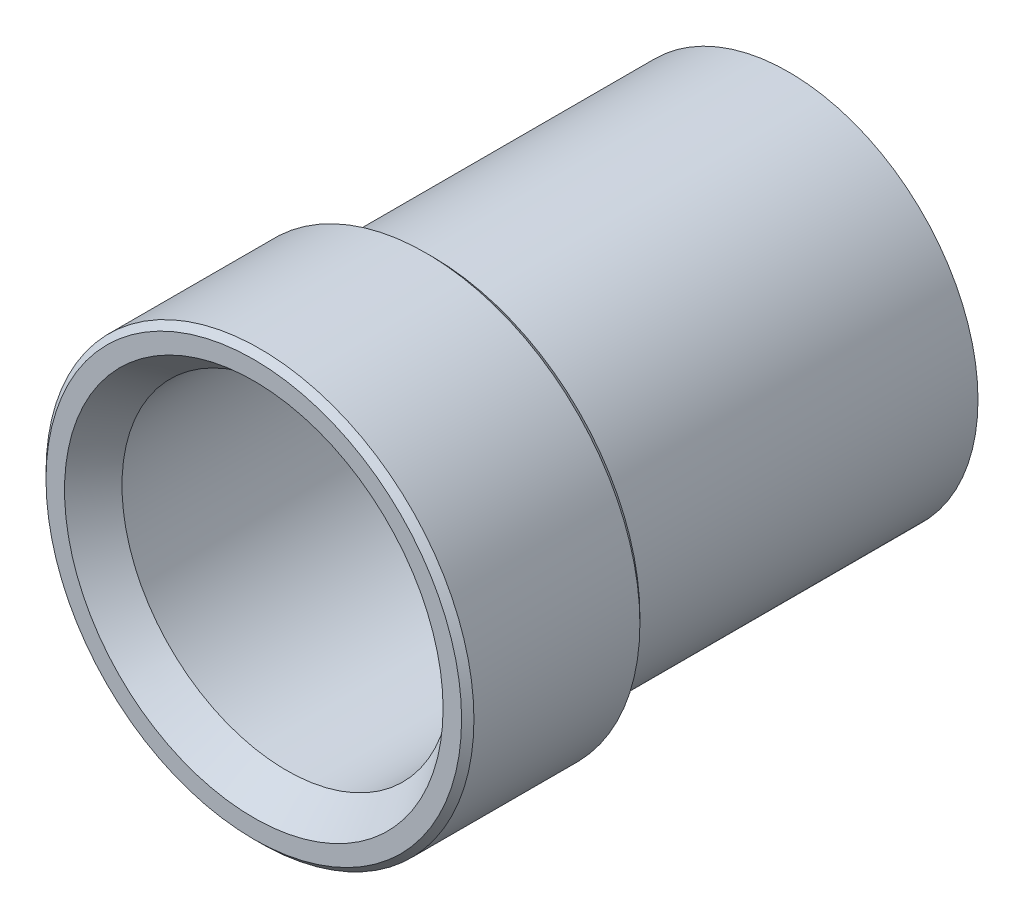
ISO-10303-21;
HEADER;
FILE_DESCRIPTION(('STEP AP214'),'2;1');
FILE_NAME('part.step','',(''),(''),'','','');
FILE_SCHEMA(('AUTOMOTIVE_DESIGN { 1 0 10303 214 1 1 1 1 }'));
ENDSEC;
DATA;
#1=APPLICATION_CONTEXT('core data for automotive mechanical design processes');
#2=APPLICATION_PROTOCOL_DEFINITION('international standard','automotive_design',2000,#1);
#3=PRODUCT_CONTEXT('',#1,'mechanical');
#4=PRODUCT('Part','Part','',(#3));
#5=PRODUCT_RELATED_PRODUCT_CATEGORY('part','',(#4));
#6=PRODUCT_DEFINITION_FORMATION('','',#4);
#7=PRODUCT_DEFINITION_CONTEXT('part definition',#1,'design');
#8=PRODUCT_DEFINITION('design','',#6,#7);
#9=PRODUCT_DEFINITION_SHAPE('','',#8);
#10=(LENGTH_UNIT() NAMED_UNIT(*) SI_UNIT(.MILLI.,.METRE.));
#11=(NAMED_UNIT(*) PLANE_ANGLE_UNIT() SI_UNIT($,.RADIAN.));
#12=(NAMED_UNIT(*) SI_UNIT($,.STERADIAN.) SOLID_ANGLE_UNIT());
#13=UNCERTAINTY_MEASURE_WITH_UNIT(LENGTH_MEASURE(1.E-05),#10,'distance_accuracy_value','');
#14=(GEOMETRIC_REPRESENTATION_CONTEXT(3) GLOBAL_UNCERTAINTY_ASSIGNED_CONTEXT((#13)) GLOBAL_UNIT_ASSIGNED_CONTEXT((#10,
#11,#12)) REPRESENTATION_CONTEXT('',''));
#15=CARTESIAN_POINT('',(0.,0.,0.));
#16=DIRECTION('',(0.,0.,1.));
#17=DIRECTION('',(1.,0.,0.));
#18=AXIS2_PLACEMENT_3D('',#15,#16,#17);
#19=CARTESIAN_POINT('',(0.,0.,5.159375));
#20=DIRECTION('',(0.,0.,1.));
#21=DIRECTION('',(1.,0.,0.));
#22=AXIS2_PLACEMENT_3D('',#19,#20,#21);
#23=CYLINDRICAL_SURFACE('',#22,3.175);
#24=CARTESIAN_POINT('',(0.,0.,-5.159375));
#25=DIRECTION('',(0.,0.,1.));
#26=DIRECTION('',(1.,0.,0.));
#27=AXIS2_PLACEMENT_3D('',#24,#25,#26);
#28=CIRCLE('',#27,3.175);
#29=CARTESIAN_POINT('',(3.175,0.,-5.159375));
#30=VERTEX_POINT('',#29);
#31=EDGE_CURVE('E64',#30,#30,#28,.T.);
#32=ORIENTED_EDGE('',*,*,#31,.F.);
#33=EDGE_LOOP('',(#32));
#34=FACE_BOUND('',#33,.T.);
#35=CARTESIAN_POINT('',(0.,0.,4.52736990370328));
#36=DIRECTION('',(0.,0.,1.));
#37=DIRECTION('',(1.,0.,0.));
#38=AXIS2_PLACEMENT_3D('',#35,#36,#37);
#39=CIRCLE('',#38,3.175);
#40=CARTESIAN_POINT('',(3.175,0.,4.52736990370328));
#41=VERTEX_POINT('',#40);
#42=EDGE_CURVE('E52',#41,#41,#39,.T.);
#43=ORIENTED_EDGE('',*,*,#42,.T.);
#44=EDGE_LOOP('',(#43));
#45=FACE_BOUND('',#44,.T.);
#46=ADVANCED_FACE('F32',(#34,#45),#23,.F.);
#47=CARTESIAN_POINT('',(0.,0.,5.159375));
#48=DIRECTION('',(0.,0.,1.));
#49=DIRECTION('',(1.,0.,0.));
#50=AXIS2_PLACEMENT_3D('',#47,#48,#49);
#51=CONICAL_SURFACE('',#50,3.65125,0.645771823237904);
#52=ORIENTED_EDGE('',*,*,#42,.F.);
#53=EDGE_LOOP('',(#52));
#54=FACE_BOUND('',#53,.T.);
#55=CARTESIAN_POINT('',(0.,0.,5.159375));
#56=DIRECTION('',(0.,0.,1.));
#57=DIRECTION('',(1.,0.,0.));
#58=AXIS2_PLACEMENT_3D('',#55,#56,#57);
#59=CIRCLE('',#58,3.65125);
#60=CARTESIAN_POINT('',(3.65125,0.,5.159375));
#61=VERTEX_POINT('',#60);
#62=EDGE_CURVE('E55',#61,#61,#59,.T.);
#63=ORIENTED_EDGE('',*,*,#62,.T.);
#64=EDGE_LOOP('',(#63));
#65=FACE_BOUND('',#64,.T.);
#66=ADVANCED_FACE('F72',(#54,#65),#51,.F.);
#67=CARTESIAN_POINT('',(0.,3.65125,5.159375));
#68=DIRECTION('',(0.,0.,-1.));
#69=DIRECTION('',(-1.,0.,0.));
#70=AXIS2_PLACEMENT_3D('',#67,#68,#69);
#71=PLANE('',#70);
#72=CARTESIAN_POINT('',(0.,0.,5.159375));
#73=DIRECTION('',(0.,0.,-1.));
#74=DIRECTION('',(-1.,0.,0.));
#75=AXIS2_PLACEMENT_3D('',#72,#73,#74);
#76=CIRCLE('',#75,4.0084375);
#77=CARTESIAN_POINT('',(-4.0084375,0.,5.159375));
#78=VERTEX_POINT('',#77);
#79=EDGE_CURVE('E47',#78,#78,#76,.F.);
#80=ORIENTED_EDGE('',*,*,#79,.T.);
#81=EDGE_LOOP('',(#80));
#82=FACE_BOUND('',#81,.T.);
#83=ORIENTED_EDGE('',*,*,#62,.F.);
#84=EDGE_LOOP('',(#83));
#85=FACE_BOUND('',#84,.T.);
#86=ADVANCED_FACE('F78',(#82,#85),#71,.F.);
#87=CARTESIAN_POINT('',(0.,0.,5.159375));
#88=DIRECTION('',(0.,0.,1.));
#89=DIRECTION('',(1.,0.,0.));
#90=AXIS2_PLACEMENT_3D('',#87,#88,#89);
#91=CYLINDRICAL_SURFACE('',#90,4.1275);
#92=CARTESIAN_POINT('',(0.,0.,5.0403125));
#93=DIRECTION('',(0.,0.,-1.));
#94=DIRECTION('',(-1.,0.,0.));
#95=AXIS2_PLACEMENT_3D('',#92,#93,#94);
#96=CIRCLE('',#95,4.1275);
#97=CARTESIAN_POINT('',(-4.1275,0.,5.0403125));
#98=VERTEX_POINT('',#97);
#99=EDGE_CURVE('E39',#98,#98,#96,.T.);
#100=ORIENTED_EDGE('',*,*,#99,.T.);
#101=EDGE_LOOP('',(#100));
#102=FACE_BOUND('',#101,.T.);
#103=CARTESIAN_POINT('',(0.,0.,1.83885416666667));
#104=DIRECTION('',(0.,0.,1.));
#105=DIRECTION('',(1.,0.,0.));
#106=AXIS2_PLACEMENT_3D('',#103,#104,#105);
#107=CIRCLE('',#106,4.1275);
#108=CARTESIAN_POINT('',(4.1275,0.,1.83885416666667));
#109=VERTEX_POINT('',#108);
#110=EDGE_CURVE('E43',#109,#109,#107,.T.);
#111=ORIENTED_EDGE('',*,*,#110,.T.);
#112=EDGE_LOOP('',(#111));
#113=FACE_BOUND('',#112,.T.);
#114=ADVANCED_FACE('F83',(#102,#113),#91,.T.);
#115=CARTESIAN_POINT('',(0.,4.1275,1.71979166666667));
#116=DIRECTION('',(0.,0.,1.));
#117=DIRECTION('',(1.,0.,0.));
#118=AXIS2_PLACEMENT_3D('',#115,#116,#117);
#119=PLANE('',#118);
#120=CARTESIAN_POINT('',(0.,0.,1.71979166666667));
#121=DIRECTION('',(0.,0.,1.));
#122=DIRECTION('',(1.,0.,0.));
#123=AXIS2_PLACEMENT_3D('',#120,#121,#122);
#124=CIRCLE('',#123,4.0084375);
#125=CARTESIAN_POINT('',(4.0084375,0.,1.71979166666667));
#126=VERTEX_POINT('',#125);
#127=EDGE_CURVE('E10',#126,#126,#124,.F.);
#128=ORIENTED_EDGE('',*,*,#127,.T.);
#129=EDGE_LOOP('',(#128));
#130=FACE_BOUND('',#129,.T.);
#131=CARTESIAN_POINT('',(0.,0.,1.71979166666667));
#132=DIRECTION('',(0.,0.,1.));
#133=DIRECTION('',(1.,0.,0.));
#134=AXIS2_PLACEMENT_3D('',#131,#132,#133);
#135=CIRCLE('',#134,3.65125);
#136=CARTESIAN_POINT('',(3.65125,0.,1.71979166666667));
#137=VERTEX_POINT('',#136);
#138=EDGE_CURVE('E58',#137,#137,#135,.T.);
#139=ORIENTED_EDGE('',*,*,#138,.T.);
#140=EDGE_LOOP('',(#139));
#141=FACE_BOUND('',#140,.T.);
#142=ADVANCED_FACE('F89',(#130,#141),#119,.F.);
#143=CARTESIAN_POINT('',(0.,0.,5.159375));
#144=DIRECTION('',(0.,0.,1.));
#145=DIRECTION('',(1.,0.,0.));
#146=AXIS2_PLACEMENT_3D('',#143,#144,#145);
#147=CYLINDRICAL_SURFACE('',#146,3.65125);
#148=ORIENTED_EDGE('',*,*,#138,.F.);
#149=EDGE_LOOP('',(#148));
#150=FACE_BOUND('',#149,.T.);
#151=CARTESIAN_POINT('',(0.,0.,-5.159375));
#152=DIRECTION('',(0.,0.,1.));
#153=DIRECTION('',(1.,0.,0.));
#154=AXIS2_PLACEMENT_3D('',#151,#152,#153);
#155=CIRCLE('',#154,3.65125);
#156=CARTESIAN_POINT('',(3.65125,0.,-5.159375));
#157=VERTEX_POINT('',#156);
#158=EDGE_CURVE('E61',#157,#157,#155,.T.);
#159=ORIENTED_EDGE('',*,*,#158,.T.);
#160=EDGE_LOOP('',(#159));
#161=FACE_BOUND('',#160,.T.);
#162=ADVANCED_FACE('F100',(#150,#161),#147,.T.);
#163=CARTESIAN_POINT('',(0.,3.65125,-5.159375));
#164=DIRECTION('',(0.,0.,1.));
#165=DIRECTION('',(1.,0.,0.));
#166=AXIS2_PLACEMENT_3D('',#163,#164,#165);
#167=PLANE('',#166);
#168=ORIENTED_EDGE('',*,*,#158,.F.);
#169=EDGE_LOOP('',(#168));
#170=FACE_BOUND('',#169,.T.);
#171=ORIENTED_EDGE('',*,*,#31,.T.);
#172=EDGE_LOOP('',(#171));
#173=FACE_BOUND('',#172,.T.);
#174=ADVANCED_FACE('F68',(#170,#173),#167,.F.);
#175=CARTESIAN_POINT('',(0.,0.,5.159375));
#176=DIRECTION('',(0.,0.,-1.));
#177=DIRECTION('',(-1.,0.,0.));
#178=AXIS2_PLACEMENT_3D('',#175,#176,#177);
#179=CONICAL_SURFACE('',#178,4.0084375,0.785398163397459);
#180=CARTESIAN_POINT('',(-4.1275,0.,5.0403125));
#181=CARTESIAN_POINT('',(-4.126259765625,0.,5.041552734375));
#182=CARTESIAN_POINT('',(-4.12501953125,0.,5.04279296875));
#183=CARTESIAN_POINT('',(-4.1225390625,0.,5.0452734375));
#184=CARTESIAN_POINT('',(-4.121298828125,0.,5.046513671875));
#185=CARTESIAN_POINT('',(-4.118818359375,0.,5.048994140625));
#186=CARTESIAN_POINT('',(-4.117578125,0.,5.050234375));
#187=CARTESIAN_POINT('',(-4.11509765625,0.,5.05271484375));
#188=CARTESIAN_POINT('',(-4.113857421875,0.,5.053955078125));
#189=CARTESIAN_POINT('',(-4.111376953125,0.,5.056435546875));
#190=CARTESIAN_POINT('',(-4.11013671875,0.,5.05767578125));
#191=CARTESIAN_POINT('',(-4.10765625,0.,5.06015625));
#192=CARTESIAN_POINT('',(-4.106416015625,0.,5.061396484375));
#193=CARTESIAN_POINT('',(-4.103935546875,0.,5.063876953125));
#194=CARTESIAN_POINT('',(-4.1026953125,0.,5.0651171875));
#195=CARTESIAN_POINT('',(-4.10021484375,0.,5.06759765625));
#196=CARTESIAN_POINT('',(-4.098974609375,0.,5.068837890625));
#197=CARTESIAN_POINT('',(-4.096494140625,0.,5.071318359375));
#198=CARTESIAN_POINT('',(-4.09525390625,0.,5.07255859375));
#199=CARTESIAN_POINT('',(-4.0927734375,0.,5.0750390625));
#200=CARTESIAN_POINT('',(-4.091533203125,0.,5.076279296875));
#201=CARTESIAN_POINT('',(-4.089052734375,0.,5.078759765625));
#202=CARTESIAN_POINT('',(-4.0878125,0.,5.08));
#203=CARTESIAN_POINT('',(-4.08533203125,0.,5.08248046875));
#204=CARTESIAN_POINT('',(-4.084091796875,0.,5.083720703125));
#205=CARTESIAN_POINT('',(-4.081611328125,0.,5.086201171875));
#206=CARTESIAN_POINT('',(-4.08037109375,0.,5.08744140625));
#207=CARTESIAN_POINT('',(-4.077890625,0.,5.089921875));
#208=CARTESIAN_POINT('',(-4.076650390625,0.,5.091162109375));
#209=CARTESIAN_POINT('',(-4.074169921875,0.,5.093642578125));
#210=CARTESIAN_POINT('',(-4.0729296875,0.,5.0948828125));
#211=CARTESIAN_POINT('',(-4.07044921875,0.,5.09736328125));
#212=CARTESIAN_POINT('',(-4.069208984375,0.,5.098603515625));
#213=CARTESIAN_POINT('',(-4.066728515625,0.,5.101083984375));
#214=CARTESIAN_POINT('',(-4.06548828125,0.,5.10232421875));
#215=CARTESIAN_POINT('',(-4.0630078125,0.,5.1048046875));
#216=CARTESIAN_POINT('',(-4.061767578125,0.,5.106044921875));
#217=CARTESIAN_POINT('',(-4.059287109375,0.,5.108525390625));
#218=CARTESIAN_POINT('',(-4.058046875,0.,5.109765625));
#219=CARTESIAN_POINT('',(-4.05556640625,0.,5.11224609375));
#220=CARTESIAN_POINT('',(-4.054326171875,0.,5.113486328125));
#221=CARTESIAN_POINT('',(-4.051845703125,0.,5.115966796875));
#222=CARTESIAN_POINT('',(-4.05060546875,0.,5.11720703125));
#223=CARTESIAN_POINT('',(-4.048125,0.,5.1196875));
#224=CARTESIAN_POINT('',(-4.046884765625,0.,5.120927734375));
#225=CARTESIAN_POINT('',(-4.044404296875,0.,5.123408203125));
#226=CARTESIAN_POINT('',(-4.0431640625,0.,5.1246484375));
#227=CARTESIAN_POINT('',(-4.04068359375,0.,5.12712890625));
#228=CARTESIAN_POINT('',(-4.039443359375,0.,5.128369140625));
#229=CARTESIAN_POINT('',(-4.036962890625,0.,5.130849609375));
#230=CARTESIAN_POINT('',(-4.03572265625,0.,5.13208984375));
#231=CARTESIAN_POINT('',(-4.0332421875,0.,5.1345703125));
#232=CARTESIAN_POINT('',(-4.032001953125,0.,5.135810546875));
#233=CARTESIAN_POINT('',(-4.029521484375,0.,5.138291015625));
#234=CARTESIAN_POINT('',(-4.02828125,0.,5.13953125));
#235=CARTESIAN_POINT('',(-4.02580078125,0.,5.14201171875));
#236=CARTESIAN_POINT('',(-4.024560546875,0.,5.143251953125));
#237=CARTESIAN_POINT('',(-4.022080078125,0.,5.145732421875));
#238=CARTESIAN_POINT('',(-4.02083984375,0.,5.14697265625));
#239=CARTESIAN_POINT('',(-4.018359375,0.,5.149453125));
#240=CARTESIAN_POINT('',(-4.017119140625,0.,5.150693359375));
#241=CARTESIAN_POINT('',(-4.014638671875,0.,5.153173828125));
#242=CARTESIAN_POINT('',(-4.0133984375,0.,5.1544140625));
#243=CARTESIAN_POINT('',(-4.01091796875,0.,5.15689453125));
#244=CARTESIAN_POINT('',(-4.009677734375,0.,5.158134765625));
#245=CARTESIAN_POINT('',(-4.0084375,0.,5.159375));
#246=B_SPLINE_CURVE_WITH_KNOTS('',3,(#180,#181,#182,#183,#184,#185,#186,#187,#188,#189,#190,
#191,#192,#193,#194,#195,#196,#197,#198,#199,#200,#201,#202,#203,#204,#205,#206,#207,#208,#209,
#210,#211,#212,#213,#214,#215,#216,#217,#218,#219,#220,#221,#222,#223,#224,#225,#226,#227,#228,
#229,#230,#231,#232,#233,#234,#235,#236,#237,#238,#239,#240,#241,#242,#243,#244,#245),
.UNSPECIFIED.,.F.,.F.,(4,2,2,2,2,2,2,2,2,2,2,2,2,2,2,2,2,2,2,2,2,2,2,2,2,2,2,2,2,2,2,2,4),(0.,
0.0052618688209397,0.0105237376418782,0.0157856064628172,0.0210474752837563,0.0263093441046948,
0.0315712129256339,0.036833081746573,0.0420949505675121,0.0473568193884505,0.0526186882093902,
0.0578805570303287,0.0631424258512672,0.0684042946722069,0.0736661634931453,0.0789280323140844,
0.0841899011350229,0.0894517699559619,0.094713638776901,0.0999755075978395,0.105237376418779,
0.110499245239718,0.115761114060656,0.121022982881596,0.126284851702534,0.131546720523473,
0.136808589344412,0.142070458165351,0.14733232698629,0.152594195807229,0.157856064628168,
0.163117933449107,0.168379802270046),.UNSPECIFIED.);
#247=EDGE_CURVE('BSEAM92',#98,#78,#246,.T.);
#248=ORIENTED_EDGE('',*,*,#99,.F.);
#249=ORIENTED_EDGE('',*,*,#79,.F.);
#250=ORIENTED_EDGE('',*,*,#247,.T.);
#251=ORIENTED_EDGE('',*,*,#247,.F.);
#252=EDGE_LOOP('',(#248,#250,#249,#251));
#253=FACE_BOUND('',#252,.T.);
#254=ADVANCED_FACE('F92',(#253),#179,.T.);
#255=CARTESIAN_POINT('',(0.,0.,1.83885416666667));
#256=DIRECTION('',(0.,0.,1.));
#257=DIRECTION('',(1.,0.,0.));
#258=AXIS2_PLACEMENT_3D('',#255,#256,#257);
#259=CONICAL_SURFACE('',#258,4.1275,0.785398163397448);
#260=ORIENTED_EDGE('',*,*,#127,.F.);
#261=EDGE_LOOP('',(#260));
#262=FACE_BOUND('',#261,.T.);
#263=ORIENTED_EDGE('',*,*,#110,.F.);
#264=EDGE_LOOP('',(#263));
#265=FACE_BOUND('',#264,.T.);
#266=ADVANCED_FACE('F34',(#262,#265),#259,.T.);
#267=CLOSED_SHELL('',(#46,#66,#86,#114,#142,#162,#174,#254,#266));
#268=MANIFOLD_SOLID_BREP('B2',#267);
#269=ADVANCED_BREP_SHAPE_REPRESENTATION('',(#18,#268),#14);
#270=SHAPE_DEFINITION_REPRESENTATION(#9,#269);
ENDSEC;
END-ISO-10303-21;
